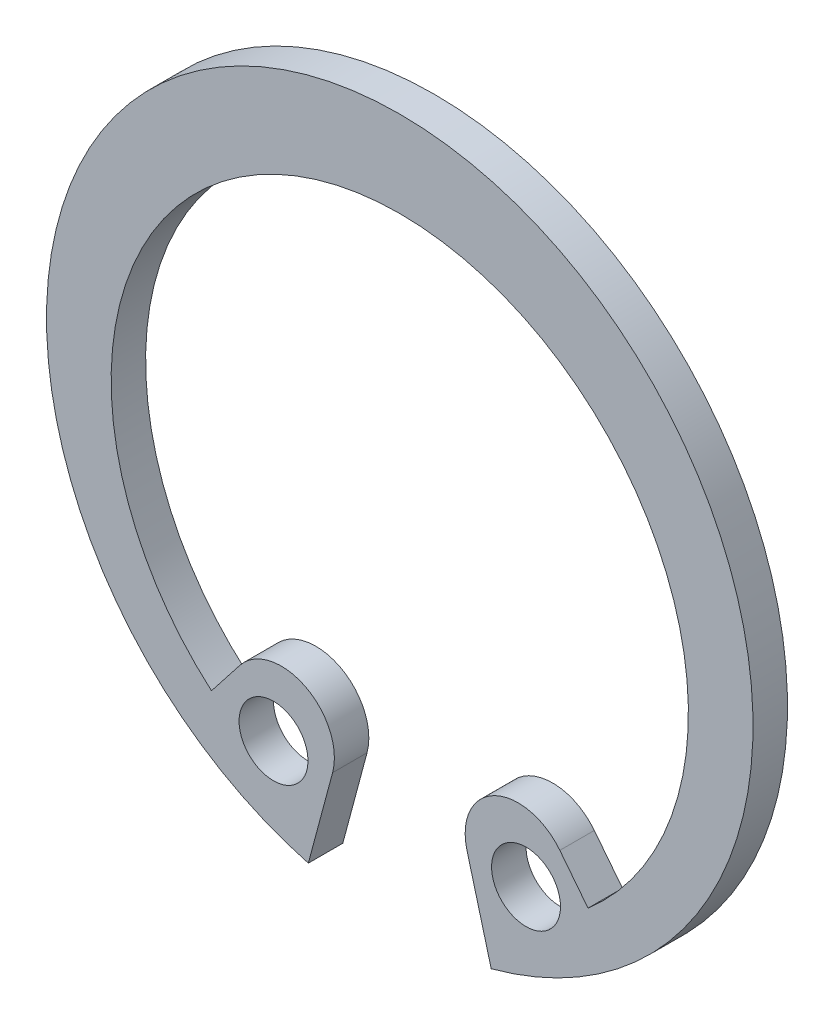
ISO-10303-21;
HEADER;
FILE_DESCRIPTION(('STEP AP214'),'2;1');
FILE_NAME('part.step','',(''),(''),'','','');
FILE_SCHEMA(('AUTOMOTIVE_DESIGN { 1 0 10303 214 1 1 1 1 }'));
ENDSEC;
DATA;
#1=APPLICATION_CONTEXT('core data for automotive mechanical design processes');
#2=APPLICATION_PROTOCOL_DEFINITION('international standard','automotive_design',2000,#1);
#3=PRODUCT_CONTEXT('',#1,'mechanical');
#4=PRODUCT('Part','Part','',(#3));
#5=PRODUCT_RELATED_PRODUCT_CATEGORY('part','',(#4));
#6=PRODUCT_DEFINITION_FORMATION('','',#4);
#7=PRODUCT_DEFINITION_CONTEXT('part definition',#1,'design');
#8=PRODUCT_DEFINITION('design','',#6,#7);
#9=PRODUCT_DEFINITION_SHAPE('','',#8);
#10=(LENGTH_UNIT() NAMED_UNIT(*) SI_UNIT(.MILLI.,.METRE.));
#11=(NAMED_UNIT(*) PLANE_ANGLE_UNIT() SI_UNIT($,.RADIAN.));
#12=(NAMED_UNIT(*) SI_UNIT($,.STERADIAN.) SOLID_ANGLE_UNIT());
#13=UNCERTAINTY_MEASURE_WITH_UNIT(LENGTH_MEASURE(1.E-05),#10,'distance_accuracy_value','');
#14=(GEOMETRIC_REPRESENTATION_CONTEXT(3) GLOBAL_UNCERTAINTY_ASSIGNED_CONTEXT((#13)) GLOBAL_UNIT_ASSIGNED_CONTEXT((#10,
#11,#12)) REPRESENTATION_CONTEXT('',''));
#15=CARTESIAN_POINT('',(0.,0.,0.));
#16=DIRECTION('',(0.,0.,1.));
#17=DIRECTION('',(1.,0.,0.));
#18=AXIS2_PLACEMENT_3D('',#15,#16,#17);
#19=CARTESIAN_POINT('',(3.43458284128226,-6.87759383479204,0.));
#20=DIRECTION('',(0.,0.,-1.));
#21=DIRECTION('',(-1.,0.,0.));
#22=AXIS2_PLACEMENT_3D('',#19,#20,#21);
#23=CYLINDRICAL_SURFACE('',#22,1.5375);
#24=DIRECTION('',(0.,0.,-1.));
#25=VECTOR('',#24,1.);
#26=CARTESIAN_POINT('',(4.64492717189912,-5.92945204616356,1.));
#27=LINE('',#26,#25);
#28=CARTESIAN_POINT('',(4.64492717189912,-5.92945204616356,0.));
#29=VERTEX_POINT('',#28);
#30=CARTESIAN_POINT('',(4.64492717189912,-5.92945204616356,1.));
#31=VERTEX_POINT('',#30);
#32=EDGE_CURVE('E169',#29,#31,#27,.F.);
#33=ORIENTED_EDGE('',*,*,#32,.F.);
#34=CARTESIAN_POINT('',(3.43458284128226,-6.87759383479204,0.));
#35=DIRECTION('',(0.,0.,1.));
#36=DIRECTION('',(1.,0.,0.));
#37=AXIS2_PLACEMENT_3D('',#34,#35,#36);
#38=CIRCLE('',#37,1.5375);
#39=CARTESIAN_POINT('',(1.94947188336281,-7.27552811663715,0.));
#40=VERTEX_POINT('',#39);
#41=EDGE_CURVE('E43',#40,#29,#38,.F.);
#42=ORIENTED_EDGE('',*,*,#41,.F.);
#43=DIRECTION('',(0.,0.,-1.));
#44=VECTOR('',#43,1.);
#45=CARTESIAN_POINT('',(1.94947188336281,-7.27552811663716,1.));
#46=LINE('',#45,#44);
#47=CARTESIAN_POINT('',(1.94947188336281,-7.27552811663715,1.));
#48=VERTEX_POINT('',#47);
#49=EDGE_CURVE('E172',#48,#40,#46,.T.);
#50=ORIENTED_EDGE('',*,*,#49,.F.);
#51=CARTESIAN_POINT('',(3.43458284128226,-6.87759383479204,1.));
#52=DIRECTION('',(0.,0.,1.));
#53=DIRECTION('',(1.,0.,0.));
#54=AXIS2_PLACEMENT_3D('',#51,#52,#53);
#55=CIRCLE('',#54,1.5375);
#56=EDGE_CURVE('E11',#31,#48,#55,.T.);
#57=ORIENTED_EDGE('',*,*,#56,.F.);
#58=EDGE_LOOP('',(#33,#42,#50,#57));
#59=FACE_BOUND('',#58,.T.);
#60=ADVANCED_FACE('F36',(#59),#23,.T.);
#61=CARTESIAN_POINT('',(0.,-0.625000000000001,1.));
#62=DIRECTION('',(0.,0.,1.));
#63=DIRECTION('',(1.,0.,0.));
#64=AXIS2_PLACEMENT_3D('',#61,#62,#63);
#65=PLANE('',#64);
#66=DIRECTION('',(-0.616677586099827,0.787215824791455,0.));
#67=VECTOR('',#66,1.);
#68=CARTESIAN_POINT('',(3.87077264324927,-4.94121003846963,1.));
#69=LINE('',#68,#67);
#70=CARTESIAN_POINT('',(5.46261420785047,-6.97326519737403,1.));
#71=VERTEX_POINT('',#70);
#72=EDGE_CURVE('E156',#71,#31,#69,.T.);
#73=ORIENTED_EDGE('',*,*,#72,.T.);
#74=ORIENTED_EDGE('',*,*,#56,.T.);
#75=DIRECTION('',(0.258819045102514,-0.96592582628907,0.));
#76=VECTOR('',#75,1.);
#77=CARTESIAN_POINT('',(1.62455990280234,-6.06294009719763,1.));
#78=LINE('',#77,#76);
#79=CARTESIAN_POINT('',(2.65289521230078,-9.90073971946297,1.));
#80=VERTEX_POINT('',#79);
#81=EDGE_CURVE('E104',#48,#80,#78,.T.);
#82=ORIENTED_EDGE('',*,*,#81,.T.);
#83=CARTESIAN_POINT('',(0.,0.,1.));
#84=DIRECTION('',(0.,0.,1.));
#85=DIRECTION('',(1.,0.,0.));
#86=AXIS2_PLACEMENT_3D('',#83,#84,#85);
#87=CIRCLE('',#86,10.25);
#88=CARTESIAN_POINT('',(-2.65289521230078,-9.90073971946297,1.));
#89=VERTEX_POINT('',#88);
#90=EDGE_CURVE('E95',#80,#89,#87,.T.);
#91=ORIENTED_EDGE('',*,*,#90,.T.);
#92=DIRECTION('',(-0.258819045102514,-0.96592582628907,0.));
#93=VECTOR('',#92,1.);
#94=CARTESIAN_POINT('',(-1.62455990280234,-6.06294009719763,1.));
#95=LINE('',#94,#93);
#96=CARTESIAN_POINT('',(-1.94947188336281,-7.27552811663716,1.));
#97=VERTEX_POINT('',#96);
#98=EDGE_CURVE('E101',#97,#89,#95,.T.);
#99=ORIENTED_EDGE('',*,*,#98,.F.);
#100=CARTESIAN_POINT('',(-3.43458284128226,-6.87759383479204,1.));
#101=DIRECTION('',(0.,0.,-1.));
#102=DIRECTION('',(-1.,0.,0.));
#103=AXIS2_PLACEMENT_3D('',#100,#101,#102);
#104=CIRCLE('',#103,1.5375);
#105=CARTESIAN_POINT('',(-4.64492717189912,-5.92945204616356,1.));
#106=VERTEX_POINT('',#105);
#107=EDGE_CURVE('E144',#106,#97,#104,.T.);
#108=ORIENTED_EDGE('',*,*,#107,.F.);
#109=DIRECTION('',(0.616677586099826,0.787215824791455,0.));
#110=VECTOR('',#109,1.);
#111=CARTESIAN_POINT('',(-3.87077264324927,-4.94121003846963,1.));
#112=LINE('',#111,#110);
#113=CARTESIAN_POINT('',(-5.46261420785047,-6.97326519737403,1.));
#114=VERTEX_POINT('',#113);
#115=EDGE_CURVE('E124',#114,#106,#112,.T.);
#116=ORIENTED_EDGE('',*,*,#115,.F.);
#117=CARTESIAN_POINT('',(0.,-0.625000000000001,1.));
#118=DIRECTION('',(0.,0.,-1.));
#119=DIRECTION('',(1.,0.,0.));
#120=AXIS2_PLACEMENT_3D('',#117,#118,#119);
#121=CIRCLE('',#120,8.37500000000001);
#122=EDGE_CURVE('E108',#114,#71,#121,.T.);
#123=ORIENTED_EDGE('',*,*,#122,.T.);
#124=EDGE_LOOP('',(#73,#74,#82,#91,#99,#108,#116,#123));
#125=FACE_BOUND('',#124,.T.);
#126=CARTESIAN_POINT('',(3.66355503070107,-7.33610009044484,1.));
#127=DIRECTION('',(0.,0.,1.));
#128=DIRECTION('',(1.,0.,0.));
#129=AXIS2_PLACEMENT_3D('',#126,#127,#128);
#130=CIRCLE('',#129,1.);
#131=CARTESIAN_POINT('',(4.66355503070107,-7.33610009044484,1.));
#132=VERTEX_POINT('',#131);
#133=EDGE_CURVE('E147',#132,#132,#130,.T.);
#134=ORIENTED_EDGE('',*,*,#133,.F.);
#135=EDGE_LOOP('',(#134));
#136=FACE_BOUND('',#135,.T.);
#137=CARTESIAN_POINT('',(-3.66355503070107,-7.33610009044485,1.));
#138=DIRECTION('',(0.,0.,-1.));
#139=DIRECTION('',(-1.,0.,0.));
#140=AXIS2_PLACEMENT_3D('',#137,#138,#139);
#141=CIRCLE('',#140,1.);
#142=CARTESIAN_POINT('',(-4.66355503070107,-7.33610009044485,1.));
#143=VERTEX_POINT('',#142);
#144=EDGE_CURVE('E134',#143,#143,#141,.T.);
#145=ORIENTED_EDGE('',*,*,#144,.T.);
#146=EDGE_LOOP('',(#145));
#147=FACE_BOUND('',#146,.T.);
#148=ADVANCED_FACE('F97',(#125,#136,#147),#65,.T.);
#149=CARTESIAN_POINT('',(0.,-0.625000000000001,0.));
#150=DIRECTION('',(0.,0.,1.));
#151=DIRECTION('',(1.,0.,0.));
#152=AXIS2_PLACEMENT_3D('',#149,#150,#151);
#153=PLANE('',#152);
#154=DIRECTION('',(0.258819045102514,-0.96592582628907,0.));
#155=VECTOR('',#154,1.);
#156=CARTESIAN_POINT('',(1.62455990280234,-6.06294009719763,0.));
#157=LINE('',#156,#155);
#158=CARTESIAN_POINT('',(2.65289521230078,-9.90073971946297,0.));
#159=VERTEX_POINT('',#158);
#160=EDGE_CURVE('E150',#40,#159,#157,.T.);
#161=ORIENTED_EDGE('',*,*,#160,.F.);
#162=ORIENTED_EDGE('',*,*,#41,.T.);
#163=DIRECTION('',(-0.616677586099827,0.787215824791455,0.));
#164=VECTOR('',#163,1.);
#165=CARTESIAN_POINT('',(3.87077264324927,-4.94121003846963,0.));
#166=LINE('',#165,#164);
#167=CARTESIAN_POINT('',(5.46261420785047,-6.97326519737403,0.));
#168=VERTEX_POINT('',#167);
#169=EDGE_CURVE('E153',#168,#29,#166,.T.);
#170=ORIENTED_EDGE('',*,*,#169,.F.);
#171=CARTESIAN_POINT('',(0.,-0.625000000000001,0.));
#172=DIRECTION('',(0.,0.,-1.));
#173=DIRECTION('',(1.,0.,0.));
#174=AXIS2_PLACEMENT_3D('',#171,#172,#173);
#175=CIRCLE('',#174,8.37500000000001);
#176=CARTESIAN_POINT('',(-5.46261420785047,-6.97326519737403,0.));
#177=VERTEX_POINT('',#176);
#178=EDGE_CURVE('E161',#177,#168,#175,.T.);
#179=ORIENTED_EDGE('',*,*,#178,.F.);
#180=DIRECTION('',(0.616677586099826,0.787215824791455,0.));
#181=VECTOR('',#180,1.);
#182=CARTESIAN_POINT('',(-3.87077264324927,-4.94121003846963,0.));
#183=LINE('',#182,#181);
#184=CARTESIAN_POINT('',(-4.64492717189912,-5.92945204616356,0.));
#185=VERTEX_POINT('',#184);
#186=EDGE_CURVE('E125',#177,#185,#183,.T.);
#187=ORIENTED_EDGE('',*,*,#186,.T.);
#188=CARTESIAN_POINT('',(-3.43458284128226,-6.87759383479204,0.));
#189=DIRECTION('',(0.,0.,-1.));
#190=DIRECTION('',(-1.,0.,0.));
#191=AXIS2_PLACEMENT_3D('',#188,#189,#190);
#192=CIRCLE('',#191,1.5375);
#193=CARTESIAN_POINT('',(-1.94947188336281,-7.27552811663716,0.));
#194=VERTEX_POINT('',#193);
#195=EDGE_CURVE('E141',#194,#185,#192,.F.);
#196=ORIENTED_EDGE('',*,*,#195,.F.);
#197=DIRECTION('',(-0.258819045102514,-0.96592582628907,0.));
#198=VECTOR('',#197,1.);
#199=CARTESIAN_POINT('',(-1.62455990280234,-6.06294009719763,0.));
#200=LINE('',#199,#198);
#201=CARTESIAN_POINT('',(-2.65289521230078,-9.90073971946297,0.));
#202=VERTEX_POINT('',#201);
#203=EDGE_CURVE('E128',#194,#202,#200,.T.);
#204=ORIENTED_EDGE('',*,*,#203,.T.);
#205=CARTESIAN_POINT('',(0.,0.,0.));
#206=DIRECTION('',(0.,0.,1.));
#207=DIRECTION('',(1.,0.,0.));
#208=AXIS2_PLACEMENT_3D('',#205,#206,#207);
#209=CIRCLE('',#208,10.25);
#210=EDGE_CURVE('E114',#159,#202,#209,.T.);
#211=ORIENTED_EDGE('',*,*,#210,.F.);
#212=EDGE_LOOP('',(#161,#162,#170,#179,#187,#196,#204,#211));
#213=FACE_BOUND('',#212,.T.);
#214=CARTESIAN_POINT('',(3.66355503070107,-7.33610009044484,0.));
#215=DIRECTION('',(0.,0.,1.));
#216=DIRECTION('',(1.,0.,0.));
#217=AXIS2_PLACEMENT_3D('',#214,#215,#216);
#218=CIRCLE('',#217,1.);
#219=CARTESIAN_POINT('',(4.66355503070107,-7.33610009044484,0.));
#220=VERTEX_POINT('',#219);
#221=EDGE_CURVE('E146',#220,#220,#218,.T.);
#222=ORIENTED_EDGE('',*,*,#221,.T.);
#223=EDGE_LOOP('',(#222));
#224=FACE_BOUND('',#223,.T.);
#225=CARTESIAN_POINT('',(-3.66355503070107,-7.33610009044485,0.));
#226=DIRECTION('',(0.,0.,-1.));
#227=DIRECTION('',(-1.,0.,0.));
#228=AXIS2_PLACEMENT_3D('',#225,#226,#227);
#229=CIRCLE('',#228,1.);
#230=CARTESIAN_POINT('',(-4.66355503070107,-7.33610009044485,0.));
#231=VERTEX_POINT('',#230);
#232=EDGE_CURVE('E131',#231,#231,#229,.T.);
#233=ORIENTED_EDGE('',*,*,#232,.F.);
#234=EDGE_LOOP('',(#233));
#235=FACE_BOUND('',#234,.T.);
#236=ADVANCED_FACE('F176',(#213,#224,#235),#153,.F.);
#237=CARTESIAN_POINT('',(1.62455990280234,-6.06294009719763,1.));
#238=DIRECTION('',(0.96592582628907,0.258819045102514,0.));
#239=DIRECTION('',(-0.258819045102514,0.96592582628907,0.));
#240=AXIS2_PLACEMENT_3D('',#237,#238,#239);
#241=PLANE('',#240);
#242=ORIENTED_EDGE('',*,*,#81,.F.);
#243=ORIENTED_EDGE('',*,*,#49,.T.);
#244=ORIENTED_EDGE('',*,*,#160,.T.);
#245=DIRECTION('',(0.,0.,-1.));
#246=VECTOR('',#245,1.);
#247=CARTESIAN_POINT('',(2.65289521230078,-9.90073971946297,1.));
#248=LINE('',#247,#246);
#249=EDGE_CURVE('E167',#80,#159,#248,.T.);
#250=ORIENTED_EDGE('',*,*,#249,.F.);
#251=EDGE_LOOP('',(#242,#243,#244,#250));
#252=FACE_BOUND('',#251,.T.);
#253=ADVANCED_FACE('F211',(#252),#241,.F.);
#254=CARTESIAN_POINT('',(0.,0.,1.));
#255=DIRECTION('',(0.,0.,-1.));
#256=DIRECTION('',(-1.,0.,0.));
#257=AXIS2_PLACEMENT_3D('',#254,#255,#256);
#258=CYLINDRICAL_SURFACE('',#257,10.25);
#259=ORIENTED_EDGE('',*,*,#210,.T.);
#260=DIRECTION('',(0.,0.,-1.));
#261=VECTOR('',#260,1.);
#262=CARTESIAN_POINT('',(-2.65289521230078,-9.90073971946297,1.));
#263=LINE('',#262,#261);
#264=EDGE_CURVE('E111',#89,#202,#263,.T.);
#265=ORIENTED_EDGE('',*,*,#264,.F.);
#266=ORIENTED_EDGE('',*,*,#90,.F.);
#267=ORIENTED_EDGE('',*,*,#249,.T.);
#268=EDGE_LOOP('',(#259,#265,#266,#267));
#269=FACE_BOUND('',#268,.T.);
#270=ADVANCED_FACE('F112',(#269),#258,.T.);
#271=CARTESIAN_POINT('',(0.,-0.625000000000001,1.));
#272=DIRECTION('',(0.,0.,-1.));
#273=DIRECTION('',(-1.,0.,0.));
#274=AXIS2_PLACEMENT_3D('',#271,#272,#273);
#275=CYLINDRICAL_SURFACE('',#274,8.37500000000001);
#276=ORIENTED_EDGE('',*,*,#178,.T.);
#277=DIRECTION('',(0.,0.,-1.));
#278=VECTOR('',#277,1.);
#279=CARTESIAN_POINT('',(5.46261420785047,-6.97326519737403,1.));
#280=LINE('',#279,#278);
#281=EDGE_CURVE('E158',#71,#168,#280,.T.);
#282=ORIENTED_EDGE('',*,*,#281,.F.);
#283=ORIENTED_EDGE('',*,*,#122,.F.);
#284=DIRECTION('',(0.,0.,-1.));
#285=VECTOR('',#284,1.);
#286=CARTESIAN_POINT('',(-5.46261420785047,-6.97326519737403,1.));
#287=LINE('',#286,#285);
#288=EDGE_CURVE('E118',#114,#177,#287,.T.);
#289=ORIENTED_EDGE('',*,*,#288,.T.);
#290=EDGE_LOOP('',(#276,#282,#283,#289));
#291=FACE_BOUND('',#290,.T.);
#292=ADVANCED_FACE('F183',(#291),#275,.F.);
#293=CARTESIAN_POINT('',(3.87077264324927,-4.94121003846963,1.));
#294=DIRECTION('',(-0.787215824791455,-0.616677586099827,0.));
#295=DIRECTION('',(0.616677586099827,-0.787215824791455,0.));
#296=AXIS2_PLACEMENT_3D('',#293,#294,#295);
#297=PLANE('',#296);
#298=ORIENTED_EDGE('',*,*,#169,.T.);
#299=ORIENTED_EDGE('',*,*,#32,.T.);
#300=ORIENTED_EDGE('',*,*,#72,.F.);
#301=ORIENTED_EDGE('',*,*,#281,.T.);
#302=EDGE_LOOP('',(#298,#299,#300,#301));
#303=FACE_BOUND('',#302,.T.);
#304=ADVANCED_FACE('F180',(#303),#297,.F.);
#305=CARTESIAN_POINT('',(3.66355503070107,-7.33610009044484,1.));
#306=DIRECTION('',(0.,0.,-1.));
#307=DIRECTION('',(-1.,0.,0.));
#308=AXIS2_PLACEMENT_3D('',#305,#306,#307);
#309=CYLINDRICAL_SURFACE('',#308,1.);
#310=ORIENTED_EDGE('',*,*,#133,.T.);
#311=EDGE_LOOP('',(#310));
#312=FACE_BOUND('',#311,.T.);
#313=ORIENTED_EDGE('',*,*,#221,.F.);
#314=EDGE_LOOP('',(#313));
#315=FACE_BOUND('',#314,.T.);
#316=ADVANCED_FACE('F214',(#312,#315),#309,.F.);
#317=CARTESIAN_POINT('',(-3.43458284128226,-6.87759383479204,0.));
#318=DIRECTION('',(0.,0.,-1.));
#319=DIRECTION('',(1.,0.,0.));
#320=AXIS2_PLACEMENT_3D('',#317,#318,#319);
#321=CYLINDRICAL_SURFACE('',#320,1.5375);
#322=DIRECTION('',(0.,0.,-1.));
#323=VECTOR('',#322,1.);
#324=CARTESIAN_POINT('',(-4.64492717189912,-5.92945204616356,1.));
#325=LINE('',#324,#323);
#326=EDGE_CURVE('E117',#185,#106,#325,.F.);
#327=ORIENTED_EDGE('',*,*,#326,.T.);
#328=ORIENTED_EDGE('',*,*,#107,.T.);
#329=DIRECTION('',(0.,0.,-1.));
#330=VECTOR('',#329,1.);
#331=CARTESIAN_POINT('',(-1.94947188336281,-7.27552811663716,1.));
#332=LINE('',#331,#330);
#333=EDGE_CURVE('E122',#97,#194,#332,.T.);
#334=ORIENTED_EDGE('',*,*,#333,.T.);
#335=ORIENTED_EDGE('',*,*,#195,.T.);
#336=EDGE_LOOP('',(#327,#328,#334,#335));
#337=FACE_BOUND('',#336,.T.);
#338=ADVANCED_FACE('F190',(#337),#321,.T.);
#339=CARTESIAN_POINT('',(-1.62455990280234,-6.06294009719763,1.));
#340=DIRECTION('',(-0.96592582628907,0.258819045102514,0.));
#341=DIRECTION('',(0.258819045102514,0.96592582628907,0.));
#342=AXIS2_PLACEMENT_3D('',#339,#340,#341);
#343=PLANE('',#342);
#344=ORIENTED_EDGE('',*,*,#98,.T.);
#345=ORIENTED_EDGE('',*,*,#264,.T.);
#346=ORIENTED_EDGE('',*,*,#203,.F.);
#347=ORIENTED_EDGE('',*,*,#333,.F.);
#348=EDGE_LOOP('',(#344,#345,#346,#347));
#349=FACE_BOUND('',#348,.T.);
#350=ADVANCED_FACE('F120',(#349),#343,.F.);
#351=CARTESIAN_POINT('',(-3.87077264324927,-4.94121003846963,1.));
#352=DIRECTION('',(0.787215824791455,-0.616677586099826,0.));
#353=DIRECTION('',(-0.616677586099826,-0.787215824791455,0.));
#354=AXIS2_PLACEMENT_3D('',#351,#352,#353);
#355=PLANE('',#354);
#356=ORIENTED_EDGE('',*,*,#186,.F.);
#357=ORIENTED_EDGE('',*,*,#288,.F.);
#358=ORIENTED_EDGE('',*,*,#115,.T.);
#359=ORIENTED_EDGE('',*,*,#326,.F.);
#360=EDGE_LOOP('',(#356,#357,#358,#359));
#361=FACE_BOUND('',#360,.T.);
#362=ADVANCED_FACE('F191',(#361),#355,.F.);
#363=CARTESIAN_POINT('',(-3.66355503070107,-7.33610009044485,1.));
#364=DIRECTION('',(0.,0.,-1.));
#365=DIRECTION('',(1.,0.,0.));
#366=AXIS2_PLACEMENT_3D('',#363,#364,#365);
#367=CYLINDRICAL_SURFACE('',#366,1.);
#368=ORIENTED_EDGE('',*,*,#144,.F.);
#369=EDGE_LOOP('',(#368));
#370=FACE_BOUND('',#369,.T.);
#371=ORIENTED_EDGE('',*,*,#232,.T.);
#372=EDGE_LOOP('',(#371));
#373=FACE_BOUND('',#372,.T.);
#374=ADVANCED_FACE('F194',(#370,#373),#367,.F.);
#375=CLOSED_SHELL('',(#60,#148,#236,#253,#270,#292,#304,#316,#338,#350,#362,#374));
#376=MANIFOLD_SOLID_BREP('B2',#375);
#377=ADVANCED_BREP_SHAPE_REPRESENTATION('',(#18,#376),#14);
#378=SHAPE_DEFINITION_REPRESENTATION(#9,#377);
ENDSEC;
END-ISO-10303-21;
